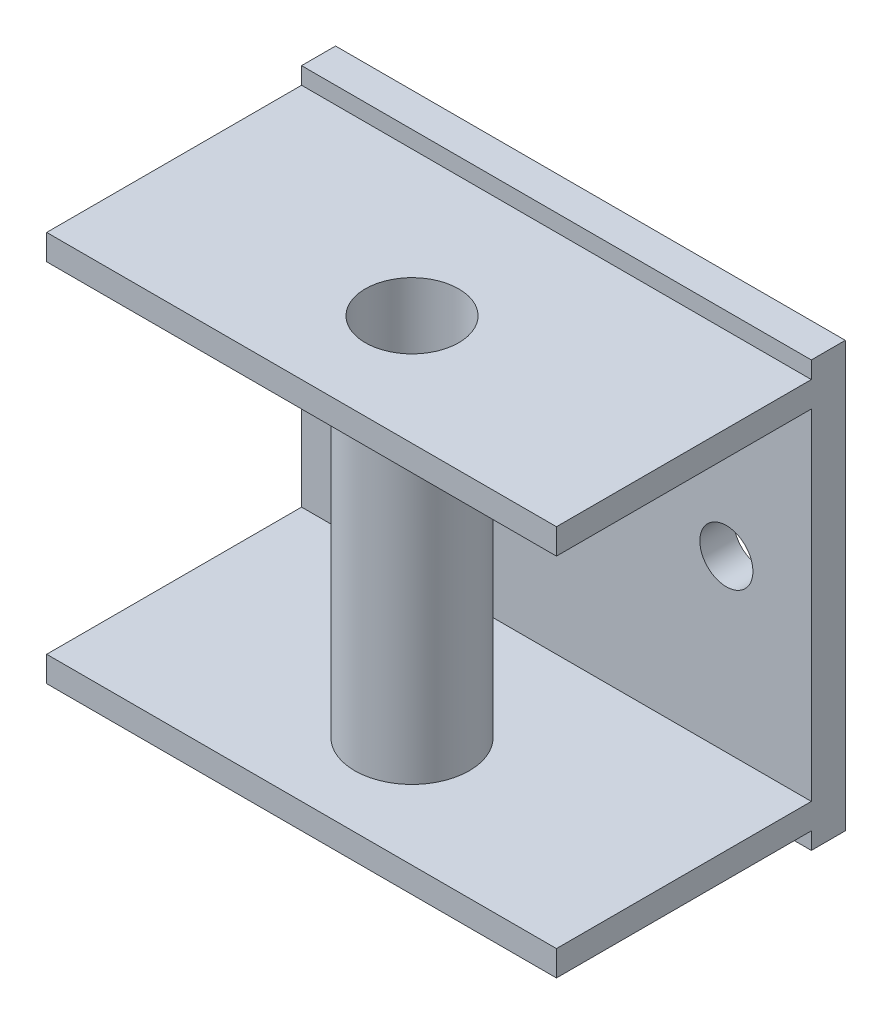
ISO-10303-21;
HEADER;
FILE_DESCRIPTION(('STEP AP214'),'2;1');
FILE_NAME('part.step','',(''),(''),'','','');
FILE_SCHEMA(('AUTOMOTIVE_DESIGN { 1 0 10303 214 1 1 1 1 }'));
ENDSEC;
DATA;
#1=APPLICATION_CONTEXT('core data for automotive mechanical design processes');
#2=APPLICATION_PROTOCOL_DEFINITION('international standard','automotive_design',2000,#1);
#3=PRODUCT_CONTEXT('',#1,'mechanical');
#4=PRODUCT('Part','Part','',(#3));
#5=PRODUCT_RELATED_PRODUCT_CATEGORY('part','',(#4));
#6=PRODUCT_DEFINITION_FORMATION('','',#4);
#7=PRODUCT_DEFINITION_CONTEXT('part definition',#1,'design');
#8=PRODUCT_DEFINITION('design','',#6,#7);
#9=PRODUCT_DEFINITION_SHAPE('','',#8);
#10=(LENGTH_UNIT() NAMED_UNIT(*) SI_UNIT(.MILLI.,.METRE.));
#11=(NAMED_UNIT(*) PLANE_ANGLE_UNIT() SI_UNIT($,.RADIAN.));
#12=(NAMED_UNIT(*) SI_UNIT($,.STERADIAN.) SOLID_ANGLE_UNIT());
#13=UNCERTAINTY_MEASURE_WITH_UNIT(LENGTH_MEASURE(1.E-05),#10,'distance_accuracy_value','');
#14=(GEOMETRIC_REPRESENTATION_CONTEXT(3) GLOBAL_UNCERTAINTY_ASSIGNED_CONTEXT((#13)) GLOBAL_UNIT_ASSIGNED_CONTEXT((#10,
#11,#12)) REPRESENTATION_CONTEXT('',''));
#15=CARTESIAN_POINT('',(0.,0.,0.));
#16=DIRECTION('',(0.,0.,1.));
#17=DIRECTION('',(1.,0.,0.));
#18=AXIS2_PLACEMENT_3D('',#15,#16,#17);
#19=CARTESIAN_POINT('',(0.,0.,8.00000000000001));
#20=DIRECTION('',(0.,0.,-1.));
#21=DIRECTION('',(-1.,0.,0.));
#22=AXIS2_PLACEMENT_3D('',#19,#20,#21);
#23=PLANE('',#22);
#24=DIRECTION('',(-1.,0.,0.));
#25=VECTOR('',#24,1.);
#26=CARTESIAN_POINT('',(-60.,46.,8.00000000000001));
#27=LINE('',#26,#25);
#28=CARTESIAN_POINT('',(60.,46.0000000000001,8.00000000000001));
#29=VERTEX_POINT('',#28);
#30=CARTESIAN_POINT('',(-60.,46.,8.00000000000001));
#31=VERTEX_POINT('',#30);
#32=EDGE_CURVE('E69',#29,#31,#27,.T.);
#33=ORIENTED_EDGE('',*,*,#32,.F.);
#34=DIRECTION('',(0.,1.,0.));
#35=VECTOR('',#34,1.);
#36=CARTESIAN_POINT('',(60.,-50.,8.00000000000023));
#37=LINE('',#36,#35);
#38=CARTESIAN_POINT('',(60.,50.,8.00000000000001));
#39=VERTEX_POINT('',#38);
#40=EDGE_CURVE('E221',#29,#39,#37,.T.);
#41=ORIENTED_EDGE('',*,*,#40,.T.);
#42=DIRECTION('',(-1.,0.,0.));
#43=VECTOR('',#42,1.);
#44=CARTESIAN_POINT('',(-60.,50.,8.00000000000001));
#45=LINE('',#44,#43);
#46=CARTESIAN_POINT('',(-60.,50.,8.00000000000001));
#47=VERTEX_POINT('',#46);
#48=EDGE_CURVE('E220',#39,#47,#45,.T.);
#49=ORIENTED_EDGE('',*,*,#48,.T.);
#50=DIRECTION('',(0.,-1.,0.));
#51=VECTOR('',#50,1.);
#52=CARTESIAN_POINT('',(-60.,-50.0000000000001,8.00000000000001));
#53=LINE('',#52,#51);
#54=EDGE_CURVE('E224',#47,#31,#53,.T.);
#55=ORIENTED_EDGE('',*,*,#54,.T.);
#56=EDGE_LOOP('',(#33,#41,#49,#55));
#57=FACE_BOUND('',#56,.T.);
#58=ADVANCED_FACE('F54',(#57),#23,.F.);
#59=CARTESIAN_POINT('',(0.,0.,8.00000000000001));
#60=DIRECTION('',(0.,0.,1.));
#61=DIRECTION('',(1.,0.,0.));
#62=AXIS2_PLACEMENT_3D('',#59,#60,#61);
#63=CIRCLE('',#62,6.25);
#64=CARTESIAN_POINT('',(-6.25,0.,8.00000000000001));
#65=VERTEX_POINT('',#64);
#66=EDGE_CURVE('E212',#65,#65,#63,.T.);
#67=ORIENTED_EDGE('',*,*,#66,.F.);
#68=EDGE_LOOP('',(#67));
#69=FACE_BOUND('',#68,.T.);
#70=CARTESIAN_POINT('',(40.,0.,7.99999999999979));
#71=DIRECTION('',(0.,0.,1.));
#72=DIRECTION('',(1.,0.,0.));
#73=AXIS2_PLACEMENT_3D('',#70,#71,#72);
#74=CIRCLE('',#73,6.25);
#75=CARTESIAN_POINT('',(33.75,0.,7.99999999999979));
#76=VERTEX_POINT('',#75);
#77=EDGE_CURVE('E206',#76,#76,#74,.T.);
#78=ORIENTED_EDGE('',*,*,#77,.F.);
#79=EDGE_LOOP('',(#78));
#80=FACE_BOUND('',#79,.T.);
#81=CARTESIAN_POINT('',(-40.,0.,8.00000000000001));
#82=DIRECTION('',(0.,0.,1.));
#83=DIRECTION('',(-1.,0.,0.));
#84=AXIS2_PLACEMENT_3D('',#81,#82,#83);
#85=CIRCLE('',#84,6.25);
#86=CARTESIAN_POINT('',(-46.25,0.,8.00000000000001));
#87=VERTEX_POINT('',#86);
#88=EDGE_CURVE('E200',#87,#87,#85,.T.);
#89=ORIENTED_EDGE('',*,*,#88,.F.);
#90=EDGE_LOOP('',(#89));
#91=FACE_BOUND('',#90,.T.);
#92=DIRECTION('',(1.,0.,0.));
#93=VECTOR('',#92,1.);
#94=CARTESIAN_POINT('',(-60.,40.,7.99999999999979));
#95=LINE('',#94,#93);
#96=CARTESIAN_POINT('',(-60.,40.,7.99999999999979));
#97=VERTEX_POINT('',#96);
#98=CARTESIAN_POINT('',(60.,40.,8.00000000000001));
#99=VERTEX_POINT('',#98);
#100=EDGE_CURVE('E164',#97,#99,#95,.T.);
#101=ORIENTED_EDGE('',*,*,#100,.F.);
#102=CARTESIAN_POINT('',(-60.,-40.,8.00000000000001));
#103=VERTEX_POINT('',#102);
#104=EDGE_CURVE('E227',#97,#103,#53,.T.);
#105=ORIENTED_EDGE('',*,*,#104,.T.);
#106=DIRECTION('',(-1.,0.,0.));
#107=VECTOR('',#106,1.);
#108=CARTESIAN_POINT('',(-60.,-40.,8.00000000000001));
#109=LINE('',#108,#107);
#110=CARTESIAN_POINT('',(60.,-40.,8.00000000000001));
#111=VERTEX_POINT('',#110);
#112=EDGE_CURVE('E170',#111,#103,#109,.T.);
#113=ORIENTED_EDGE('',*,*,#112,.F.);
#114=EDGE_CURVE('E77',#111,#99,#37,.T.);
#115=ORIENTED_EDGE('',*,*,#114,.T.);
#116=EDGE_LOOP('',(#101,#105,#113,#115));
#117=FACE_BOUND('',#116,.T.);
#118=ADVANCED_FACE('F298',(#69,#80,#91,#117),#23,.F.);
#119=DIRECTION('',(1.,0.,0.));
#120=VECTOR('',#119,1.);
#121=CARTESIAN_POINT('',(-60.,-46.,8.00000000000001));
#122=LINE('',#121,#120);
#123=CARTESIAN_POINT('',(-60.,-46.,8.00000000000001));
#124=VERTEX_POINT('',#123);
#125=CARTESIAN_POINT('',(60.,-46.,8.00000000000012));
#126=VERTEX_POINT('',#125);
#127=EDGE_CURVE('E167',#124,#126,#122,.T.);
#128=ORIENTED_EDGE('',*,*,#127,.F.);
#129=CARTESIAN_POINT('',(-60.,-50.0000000000001,8.00000000000001));
#130=VERTEX_POINT('',#129);
#131=EDGE_CURVE('E223',#124,#130,#53,.T.);
#132=ORIENTED_EDGE('',*,*,#131,.T.);
#133=DIRECTION('',(1.,0.,0.));
#134=VECTOR('',#133,1.);
#135=CARTESIAN_POINT('',(-60.,-50.0000000000001,8.00000000000001));
#136=LINE('',#135,#134);
#137=CARTESIAN_POINT('',(60.,-50.,8.00000000000023));
#138=VERTEX_POINT('',#137);
#139=EDGE_CURVE('E226',#130,#138,#136,.T.);
#140=ORIENTED_EDGE('',*,*,#139,.T.);
#141=EDGE_CURVE('E218',#138,#126,#37,.T.);
#142=ORIENTED_EDGE('',*,*,#141,.T.);
#143=EDGE_LOOP('',(#128,#132,#140,#142));
#144=FACE_BOUND('',#143,.T.);
#145=ADVANCED_FACE('F310',(#144),#23,.F.);
#146=CARTESIAN_POINT('',(0.,0.,0.));
#147=DIRECTION('',(0.,0.,-1.));
#148=DIRECTION('',(-1.,0.,0.));
#149=AXIS2_PLACEMENT_3D('',#146,#147,#148);
#150=PLANE('',#149);
#151=CARTESIAN_POINT('',(40.,0.,0.));
#152=DIRECTION('',(0.,0.,1.));
#153=DIRECTION('',(1.,0.,0.));
#154=AXIS2_PLACEMENT_3D('',#151,#152,#153);
#155=CIRCLE('',#154,6.25);
#156=CARTESIAN_POINT('',(33.75,0.,0.));
#157=VERTEX_POINT('',#156);
#158=EDGE_CURVE('E203',#157,#157,#155,.T.);
#159=ORIENTED_EDGE('',*,*,#158,.T.);
#160=EDGE_LOOP('',(#159));
#161=FACE_BOUND('',#160,.T.);
#162=DIRECTION('',(0.,1.,0.));
#163=VECTOR('',#162,1.);
#164=CARTESIAN_POINT('',(60.,-50.,0.));
#165=LINE('',#164,#163);
#166=CARTESIAN_POINT('',(60.,-50.,0.));
#167=VERTEX_POINT('',#166);
#168=CARTESIAN_POINT('',(60.,50.0000000000001,0.));
#169=VERTEX_POINT('',#168);
#170=EDGE_CURVE('E215',#167,#169,#165,.T.);
#171=ORIENTED_EDGE('',*,*,#170,.F.);
#172=DIRECTION('',(1.,0.,0.));
#173=VECTOR('',#172,1.);
#174=CARTESIAN_POINT('',(-60.,-50.0000000000001,0.));
#175=LINE('',#174,#173);
#176=CARTESIAN_POINT('',(-60.,-50.0000000000001,0.));
#177=VERTEX_POINT('',#176);
#178=EDGE_CURVE('E236',#177,#167,#175,.T.);
#179=ORIENTED_EDGE('',*,*,#178,.F.);
#180=DIRECTION('',(0.,-1.,0.));
#181=VECTOR('',#180,1.);
#182=CARTESIAN_POINT('',(-60.,-50.0000000000001,0.));
#183=LINE('',#182,#181);
#184=CARTESIAN_POINT('',(-60.,50.,0.));
#185=VERTEX_POINT('',#184);
#186=EDGE_CURVE('E234',#185,#177,#183,.T.);
#187=ORIENTED_EDGE('',*,*,#186,.F.);
#188=DIRECTION('',(-1.,0.,0.));
#189=VECTOR('',#188,1.);
#190=CARTESIAN_POINT('',(-60.,50.,0.));
#191=LINE('',#190,#189);
#192=EDGE_CURVE('E232',#169,#185,#191,.T.);
#193=ORIENTED_EDGE('',*,*,#192,.F.);
#194=EDGE_LOOP('',(#171,#179,#187,#193));
#195=FACE_BOUND('',#194,.T.);
#196=CARTESIAN_POINT('',(0.,0.,0.));
#197=DIRECTION('',(0.,0.,1.));
#198=DIRECTION('',(1.,0.,0.));
#199=AXIS2_PLACEMENT_3D('',#196,#197,#198);
#200=CIRCLE('',#199,6.25);
#201=CARTESIAN_POINT('',(-6.25,0.,0.));
#202=VERTEX_POINT('',#201);
#203=EDGE_CURVE('E209',#202,#202,#200,.T.);
#204=ORIENTED_EDGE('',*,*,#203,.T.);
#205=EDGE_LOOP('',(#204));
#206=FACE_BOUND('',#205,.T.);
#207=CARTESIAN_POINT('',(-40.,0.,0.));
#208=DIRECTION('',(0.,0.,1.));
#209=DIRECTION('',(-1.,0.,0.));
#210=AXIS2_PLACEMENT_3D('',#207,#208,#209);
#211=CIRCLE('',#210,6.25);
#212=CARTESIAN_POINT('',(-46.25,0.,0.));
#213=VERTEX_POINT('',#212);
#214=EDGE_CURVE('E199',#213,#213,#211,.T.);
#215=ORIENTED_EDGE('',*,*,#214,.T.);
#216=EDGE_LOOP('',(#215));
#217=FACE_BOUND('',#216,.T.);
#218=ADVANCED_FACE('F318',(#161,#195,#206,#217),#150,.T.);
#219=CARTESIAN_POINT('',(60.,-50.,8.00000000000023));
#220=DIRECTION('',(-1.,0.,0.));
#221=DIRECTION('',(0.,0.,1.));
#222=AXIS2_PLACEMENT_3D('',#219,#220,#221);
#223=PLANE('',#222);
#224=ORIENTED_EDGE('',*,*,#170,.T.);
#225=DIRECTION('',(0.,0.,-1.));
#226=VECTOR('',#225,1.);
#227=CARTESIAN_POINT('',(60.,50.,8.00000000000001));
#228=LINE('',#227,#226);
#229=EDGE_CURVE('E246',#39,#169,#228,.T.);
#230=ORIENTED_EDGE('',*,*,#229,.F.);
#231=ORIENTED_EDGE('',*,*,#40,.F.);
#232=DIRECTION('',(0.,0.,-1.));
#233=VECTOR('',#232,1.);
#234=CARTESIAN_POINT('',(60.,46.0000000000001,68.0000000000001));
#235=LINE('',#234,#233);
#236=CARTESIAN_POINT('',(60.,46.0000000000001,68.0000000000001));
#237=VERTEX_POINT('',#236);
#238=EDGE_CURVE('E263',#237,#29,#235,.T.);
#239=ORIENTED_EDGE('',*,*,#238,.F.);
#240=DIRECTION('',(0.,1.,0.));
#241=VECTOR('',#240,1.);
#242=CARTESIAN_POINT('',(60.,46.0000000000001,68.0000000000001));
#243=LINE('',#242,#241);
#244=CARTESIAN_POINT('',(60.,40.0000000000001,68.0000000000001));
#245=VERTEX_POINT('',#244);
#246=EDGE_CURVE('E160',#245,#237,#243,.T.);
#247=ORIENTED_EDGE('',*,*,#246,.F.);
#248=DIRECTION('',(0.,0.,-1.));
#249=VECTOR('',#248,1.);
#250=CARTESIAN_POINT('',(60.,40.0000000000001,68.0000000000001));
#251=LINE('',#250,#249);
#252=EDGE_CURVE('E172',#245,#99,#251,.T.);
#253=ORIENTED_EDGE('',*,*,#252,.T.);
#254=ORIENTED_EDGE('',*,*,#114,.F.);
#255=DIRECTION('',(0.,0.,-1.));
#256=VECTOR('',#255,1.);
#257=CARTESIAN_POINT('',(60.,-40.,68.0000000000001));
#258=LINE('',#257,#256);
#259=CARTESIAN_POINT('',(60.,-40.,68.0000000000001));
#260=VERTEX_POINT('',#259);
#261=EDGE_CURVE('E190',#260,#111,#258,.T.);
#262=ORIENTED_EDGE('',*,*,#261,.F.);
#263=DIRECTION('',(0.,1.,0.));
#264=VECTOR('',#263,1.);
#265=CARTESIAN_POINT('',(60.,-46.0000000000001,68.0000000000002));
#266=LINE('',#265,#264);
#267=CARTESIAN_POINT('',(60.,-46.0000000000001,68.0000000000002));
#268=VERTEX_POINT('',#267);
#269=EDGE_CURVE('E181',#268,#260,#266,.T.);
#270=ORIENTED_EDGE('',*,*,#269,.F.);
#271=DIRECTION('',(0.,0.,-1.));
#272=VECTOR('',#271,1.);
#273=CARTESIAN_POINT('',(60.,-46.0000000000001,68.0000000000002));
#274=LINE('',#273,#272);
#275=EDGE_CURVE('E193',#268,#126,#274,.T.);
#276=ORIENTED_EDGE('',*,*,#275,.T.);
#277=ORIENTED_EDGE('',*,*,#141,.F.);
#278=DIRECTION('',(0.,0.,-1.));
#279=VECTOR('',#278,1.);
#280=CARTESIAN_POINT('',(60.,-50.,8.00000000000023));
#281=LINE('',#280,#279);
#282=EDGE_CURVE('E229',#138,#167,#281,.T.);
#283=ORIENTED_EDGE('',*,*,#282,.T.);
#284=EDGE_LOOP('',(#224,#230,#231,#239,#247,#253,#254,#262,#270,#276,#277,#283));
#285=FACE_BOUND('',#284,.T.);
#286=ADVANCED_FACE('F56',(#285),#223,.F.);
#287=CARTESIAN_POINT('',(-60.,50.,8.00000000000001));
#288=DIRECTION('',(0.,-1.,0.));
#289=DIRECTION('',(0.,0.,-1.));
#290=AXIS2_PLACEMENT_3D('',#287,#288,#289);
#291=PLANE('',#290);
#292=ORIENTED_EDGE('',*,*,#192,.T.);
#293=DIRECTION('',(0.,0.,-1.));
#294=VECTOR('',#293,1.);
#295=CARTESIAN_POINT('',(-60.,50.,8.00000000000001));
#296=LINE('',#295,#294);
#297=EDGE_CURVE('E243',#47,#185,#296,.T.);
#298=ORIENTED_EDGE('',*,*,#297,.F.);
#299=ORIENTED_EDGE('',*,*,#48,.F.);
#300=ORIENTED_EDGE('',*,*,#229,.T.);
#301=EDGE_LOOP('',(#292,#298,#299,#300));
#302=FACE_BOUND('',#301,.T.);
#303=ADVANCED_FACE('F326',(#302),#291,.F.);
#304=CARTESIAN_POINT('',(-60.,-50.0000000000001,8.00000000000001));
#305=DIRECTION('',(1.,0.,0.));
#306=DIRECTION('',(0.,0.,-1.));
#307=AXIS2_PLACEMENT_3D('',#304,#305,#306);
#308=PLANE('',#307);
#309=ORIENTED_EDGE('',*,*,#186,.T.);
#310=DIRECTION('',(0.,0.,-1.));
#311=VECTOR('',#310,1.);
#312=CARTESIAN_POINT('',(-60.,-50.0000000000001,8.00000000000001));
#313=LINE('',#312,#311);
#314=EDGE_CURVE('E240',#130,#177,#313,.T.);
#315=ORIENTED_EDGE('',*,*,#314,.F.);
#316=ORIENTED_EDGE('',*,*,#131,.F.);
#317=DIRECTION('',(0.,0.,-1.));
#318=VECTOR('',#317,1.);
#319=CARTESIAN_POINT('',(-60.,-46.0000000000001,68.0000000000001));
#320=LINE('',#319,#318);
#321=CARTESIAN_POINT('',(-60.,-46.0000000000001,68.0000000000001));
#322=VERTEX_POINT('',#321);
#323=EDGE_CURVE('E196',#322,#124,#320,.T.);
#324=ORIENTED_EDGE('',*,*,#323,.F.);
#325=DIRECTION('',(0.,-1.,0.));
#326=VECTOR('',#325,1.);
#327=CARTESIAN_POINT('',(-60.,-46.0000000000001,68.0000000000001));
#328=LINE('',#327,#326);
#329=CARTESIAN_POINT('',(-60.,-40.,67.9999999999999));
#330=VERTEX_POINT('',#329);
#331=EDGE_CURVE('E176',#330,#322,#328,.T.);
#332=ORIENTED_EDGE('',*,*,#331,.F.);
#333=DIRECTION('',(0.,0.,-1.));
#334=VECTOR('',#333,1.);
#335=CARTESIAN_POINT('',(-60.,-40.,67.9999999999999));
#336=LINE('',#335,#334);
#337=EDGE_CURVE('E184',#330,#103,#336,.T.);
#338=ORIENTED_EDGE('',*,*,#337,.T.);
#339=ORIENTED_EDGE('',*,*,#104,.F.);
#340=DIRECTION('',(0.,0.,-1.));
#341=VECTOR('',#340,1.);
#342=CARTESIAN_POINT('',(-60.,40.,67.9999999999999));
#343=LINE('',#342,#341);
#344=CARTESIAN_POINT('',(-60.,40.,67.9999999999999));
#345=VERTEX_POINT('',#344);
#346=EDGE_CURVE('E151',#345,#97,#343,.T.);
#347=ORIENTED_EDGE('',*,*,#346,.F.);
#348=DIRECTION('',(0.,-1.,0.));
#349=VECTOR('',#348,1.);
#350=CARTESIAN_POINT('',(-60.,46.0000000000001,67.9999999999999));
#351=LINE('',#350,#349);
#352=CARTESIAN_POINT('',(-60.,46.0000000000001,67.9999999999999));
#353=VERTEX_POINT('',#352);
#354=EDGE_CURVE('E144',#353,#345,#351,.T.);
#355=ORIENTED_EDGE('',*,*,#354,.F.);
#356=DIRECTION('',(0.,0.,-1.));
#357=VECTOR('',#356,1.);
#358=CARTESIAN_POINT('',(-60.,46.0000000000001,67.9999999999999));
#359=LINE('',#358,#357);
#360=EDGE_CURVE('E149',#353,#31,#359,.T.);
#361=ORIENTED_EDGE('',*,*,#360,.T.);
#362=ORIENTED_EDGE('',*,*,#54,.F.);
#363=ORIENTED_EDGE('',*,*,#297,.T.);
#364=EDGE_LOOP('',(#309,#315,#316,#324,#332,#338,#339,#347,#355,#361,#362,#363));
#365=FACE_BOUND('',#364,.T.);
#366=ADVANCED_FACE('F146',(#365),#308,.F.);
#367=CARTESIAN_POINT('',(-60.,-50.0000000000001,8.00000000000001));
#368=DIRECTION('',(0.,1.,0.));
#369=DIRECTION('',(0.,0.,1.));
#370=AXIS2_PLACEMENT_3D('',#367,#368,#369);
#371=PLANE('',#370);
#372=ORIENTED_EDGE('',*,*,#178,.T.);
#373=ORIENTED_EDGE('',*,*,#282,.F.);
#374=ORIENTED_EDGE('',*,*,#139,.F.);
#375=ORIENTED_EDGE('',*,*,#314,.T.);
#376=EDGE_LOOP('',(#372,#373,#374,#375));
#377=FACE_BOUND('',#376,.T.);
#378=ADVANCED_FACE('F329',(#377),#371,.F.);
#379=CARTESIAN_POINT('',(0.,0.,8.00000000000001));
#380=DIRECTION('',(0.,0.,-1.));
#381=DIRECTION('',(-1.,0.,0.));
#382=AXIS2_PLACEMENT_3D('',#379,#380,#381);
#383=CYLINDRICAL_SURFACE('',#382,6.25);
#384=CARTESIAN_POINT('',(-6.25,0.,8.00000000000001));
#385=CARTESIAN_POINT('',(-6.25,0.,7.91666666666668));
#386=CARTESIAN_POINT('',(-6.25,0.,7.83333333333334));
#387=CARTESIAN_POINT('',(-6.25,0.,7.66666666666667));
#388=CARTESIAN_POINT('',(-6.25,0.,7.58333333333334));
#389=CARTESIAN_POINT('',(-6.25,0.,7.41666666666667));
#390=CARTESIAN_POINT('',(-6.25,0.,7.33333333333334));
#391=CARTESIAN_POINT('',(-6.25,0.,7.16666666666667));
#392=CARTESIAN_POINT('',(-6.25,0.,7.08333333333334));
#393=CARTESIAN_POINT('',(-6.25,0.,6.91666666666667));
#394=CARTESIAN_POINT('',(-6.25,0.,6.83333333333334));
#395=CARTESIAN_POINT('',(-6.25,0.,6.66666666666667));
#396=CARTESIAN_POINT('',(-6.25,0.,6.58333333333334));
#397=CARTESIAN_POINT('',(-6.25,0.,6.41666666666667));
#398=CARTESIAN_POINT('',(-6.25,0.,6.33333333333334));
#399=CARTESIAN_POINT('',(-6.25,0.,6.16666666666667));
#400=CARTESIAN_POINT('',(-6.25,0.,6.08333333333334));
#401=CARTESIAN_POINT('',(-6.25,0.,5.91666666666667));
#402=CARTESIAN_POINT('',(-6.25,0.,5.83333333333334));
#403=CARTESIAN_POINT('',(-6.25,0.,5.66666666666667));
#404=CARTESIAN_POINT('',(-6.25,0.,5.58333333333334));
#405=CARTESIAN_POINT('',(-6.25,0.,5.41666666666667));
#406=CARTESIAN_POINT('',(-6.25,0.,5.33333333333334));
#407=CARTESIAN_POINT('',(-6.25,0.,5.16666666666667));
#408=CARTESIAN_POINT('',(-6.25,0.,5.08333333333334));
#409=CARTESIAN_POINT('',(-6.25,0.,4.91666666666667));
#410=CARTESIAN_POINT('',(-6.25,0.,4.83333333333334));
#411=CARTESIAN_POINT('',(-6.25,0.,4.66666666666667));
#412=CARTESIAN_POINT('',(-6.25,0.,4.58333333333334));
#413=CARTESIAN_POINT('',(-6.25,0.,4.41666666666667));
#414=CARTESIAN_POINT('',(-6.25,0.,4.33333333333334));
#415=CARTESIAN_POINT('',(-6.25,0.,4.16666666666667));
#416=CARTESIAN_POINT('',(-6.25,0.,4.08333333333334));
#417=CARTESIAN_POINT('',(-6.25,0.,3.91666666666667));
#418=CARTESIAN_POINT('',(-6.25,0.,3.83333333333334));
#419=CARTESIAN_POINT('',(-6.25,0.,3.66666666666667));
#420=CARTESIAN_POINT('',(-6.25,0.,3.58333333333334));
#421=CARTESIAN_POINT('',(-6.25,0.,3.41666666666667));
#422=CARTESIAN_POINT('',(-6.25,0.,3.33333333333334));
#423=CARTESIAN_POINT('',(-6.25,0.,3.16666666666667));
#424=CARTESIAN_POINT('',(-6.25,0.,3.08333333333334));
#425=CARTESIAN_POINT('',(-6.25,0.,2.91666666666667));
#426=CARTESIAN_POINT('',(-6.25,0.,2.83333333333334));
#427=CARTESIAN_POINT('',(-6.25,0.,2.66666666666667));
#428=CARTESIAN_POINT('',(-6.25,0.,2.58333333333334));
#429=CARTESIAN_POINT('',(-6.25,0.,2.41666666666667));
#430=CARTESIAN_POINT('',(-6.25,0.,2.33333333333334));
#431=CARTESIAN_POINT('',(-6.25,0.,2.16666666666667));
#432=CARTESIAN_POINT('',(-6.25,0.,2.08333333333334));
#433=CARTESIAN_POINT('',(-6.25,0.,1.91666666666667));
#434=CARTESIAN_POINT('',(-6.25,0.,1.83333333333334));
#435=CARTESIAN_POINT('',(-6.25,0.,1.66666666666667));
#436=CARTESIAN_POINT('',(-6.25,0.,1.58333333333334));
#437=CARTESIAN_POINT('',(-6.25,0.,1.41666666666667));
#438=CARTESIAN_POINT('',(-6.25,0.,1.33333333333334));
#439=CARTESIAN_POINT('',(-6.25,0.,1.16666666666667));
#440=CARTESIAN_POINT('',(-6.25,0.,1.08333333333334));
#441=CARTESIAN_POINT('',(-6.25,0.,0.916666666666668));
#442=CARTESIAN_POINT('',(-6.25,0.,0.833333333333335));
#443=CARTESIAN_POINT('',(-6.25,0.,0.666666666666668));
#444=CARTESIAN_POINT('',(-6.25,0.,0.583333333333335));
#445=CARTESIAN_POINT('',(-6.25,0.,0.416666666666668));
#446=CARTESIAN_POINT('',(-6.25,0.,0.333333333333335));
#447=CARTESIAN_POINT('',(-6.25,0.,0.166666666666668));
#448=CARTESIAN_POINT('',(-6.25,0.,0.0833333333333348));
#449=CARTESIAN_POINT('',(-6.25,0.,0.));
#450=B_SPLINE_CURVE_WITH_KNOTS('',3,(#384,#385,#386,#387,#388,#389,#390,#391,#392,#393,#394,
#395,#396,#397,#398,#399,#400,#401,#402,#403,#404,#405,#406,#407,#408,#409,#410,#411,#412,#413,
#414,#415,#416,#417,#418,#419,#420,#421,#422,#423,#424,#425,#426,#427,#428,#429,#430,#431,#432,
#433,#434,#435,#436,#437,#438,#439,#440,#441,#442,#443,#444,#445,#446,#447,#448,#449),
.UNSPECIFIED.,.F.,.F.,(4,2,2,2,2,2,2,2,2,2,2,2,2,2,2,2,2,2,2,2,2,2,2,2,2,2,2,2,2,2,2,2,4),(0.,
0.250000000000001,0.500000000000001,0.750000000000002,1.,1.25,1.5,1.75,2.,2.25,2.5,2.75,3.,3.25,
3.5,3.75,4.,4.25,4.5,4.75000000000001,5.00000000000001,5.25000000000001,5.50000000000001,
5.75000000000001,6.00000000000001,6.25000000000001,6.50000000000001,6.75000000000001,
7.00000000000001,7.25000000000001,7.50000000000001,7.75000000000001,8.00000000000001),.UNSPECIFIED.);
#451=EDGE_CURVE('BSEAM332',#65,#202,#450,.T.);
#452=ORIENTED_EDGE('',*,*,#66,.T.);
#453=ORIENTED_EDGE('',*,*,#203,.F.);
#454=ORIENTED_EDGE('',*,*,#451,.T.);
#455=ORIENTED_EDGE('',*,*,#451,.F.);
#456=EDGE_LOOP('',(#452,#454,#453,#455));
#457=FACE_BOUND('',#456,.T.);
#458=ADVANCED_FACE('F332',(#457),#383,.F.);
#459=CARTESIAN_POINT('',(40.,0.,7.99999999999979));
#460=DIRECTION('',(0.,0.,-1.));
#461=DIRECTION('',(-1.,0.,0.));
#462=AXIS2_PLACEMENT_3D('',#459,#460,#461);
#463=CYLINDRICAL_SURFACE('',#462,6.25);
#464=CARTESIAN_POINT('',(33.75,0.,7.99999999999979));
#465=CARTESIAN_POINT('',(33.75,0.,7.91666666666646));
#466=CARTESIAN_POINT('',(33.75,0.,7.83333333333312));
#467=CARTESIAN_POINT('',(33.75,0.,7.66666666666646));
#468=CARTESIAN_POINT('',(33.75,0.,7.58333333333313));
#469=CARTESIAN_POINT('',(33.75,0.,7.41666666666647));
#470=CARTESIAN_POINT('',(33.75,0.,7.33333333333314));
#471=CARTESIAN_POINT('',(33.75,0.,7.16666666666648));
#472=CARTESIAN_POINT('',(33.75,0.,7.08333333333314));
#473=CARTESIAN_POINT('',(33.75,0.,6.91666666666648));
#474=CARTESIAN_POINT('',(33.75,0.,6.83333333333315));
#475=CARTESIAN_POINT('',(33.75,0.,6.66666666666649));
#476=CARTESIAN_POINT('',(33.75,0.,6.58333333333316));
#477=CARTESIAN_POINT('',(33.75,0.,6.4166666666665));
#478=CARTESIAN_POINT('',(33.75,0.,6.33333333333316));
#479=CARTESIAN_POINT('',(33.75,0.,6.1666666666665));
#480=CARTESIAN_POINT('',(33.75,0.,6.08333333333317));
#481=CARTESIAN_POINT('',(33.75,0.,5.91666666666651));
#482=CARTESIAN_POINT('',(33.75,0.,5.83333333333318));
#483=CARTESIAN_POINT('',(33.75,0.,5.66666666666652));
#484=CARTESIAN_POINT('',(33.75,0.,5.58333333333318));
#485=CARTESIAN_POINT('',(33.75,0.,5.41666666666652));
#486=CARTESIAN_POINT('',(33.75,0.,5.33333333333319));
#487=CARTESIAN_POINT('',(33.75,0.,5.16666666666653));
#488=CARTESIAN_POINT('',(33.75,0.,5.0833333333332));
#489=CARTESIAN_POINT('',(33.75,0.,4.91666666666654));
#490=CARTESIAN_POINT('',(33.75,0.,4.8333333333332));
#491=CARTESIAN_POINT('',(33.75,0.,4.66666666666654));
#492=CARTESIAN_POINT('',(33.75,0.,4.58333333333321));
#493=CARTESIAN_POINT('',(33.75,0.,4.41666666666655));
#494=CARTESIAN_POINT('',(33.75,0.,4.33333333333322));
#495=CARTESIAN_POINT('',(33.75,0.,4.16666666666656));
#496=CARTESIAN_POINT('',(33.75,0.,4.08333333333322));
#497=CARTESIAN_POINT('',(33.75,0.,3.91666666666656));
#498=CARTESIAN_POINT('',(33.75,0.,3.83333333333323));
#499=CARTESIAN_POINT('',(33.75,0.,3.66666666666657));
#500=CARTESIAN_POINT('',(33.75,0.,3.58333333333324));
#501=CARTESIAN_POINT('',(33.75,0.,3.41666666666658));
#502=CARTESIAN_POINT('',(33.75,0.,3.33333333333324));
#503=CARTESIAN_POINT('',(33.75,0.,3.16666666666658));
#504=CARTESIAN_POINT('',(33.75,0.,3.08333333333325));
#505=CARTESIAN_POINT('',(33.75,0.,2.91666666666659));
#506=CARTESIAN_POINT('',(33.75,0.,2.83333333333326));
#507=CARTESIAN_POINT('',(33.75,0.,2.6666666666666));
#508=CARTESIAN_POINT('',(33.75,0.,2.58333333333326));
#509=CARTESIAN_POINT('',(33.75,0.,2.4166666666666));
#510=CARTESIAN_POINT('',(33.75,0.,2.33333333333327));
#511=CARTESIAN_POINT('',(33.75,0.,2.16666666666661));
#512=CARTESIAN_POINT('',(33.75,0.,2.08333333333328));
#513=CARTESIAN_POINT('',(33.75,0.,1.91666666666662));
#514=CARTESIAN_POINT('',(33.75,0.,1.83333333333328));
#515=CARTESIAN_POINT('',(33.75,0.,1.66666666666662));
#516=CARTESIAN_POINT('',(33.75,0.,1.58333333333329));
#517=CARTESIAN_POINT('',(33.75,0.,1.41666666666663));
#518=CARTESIAN_POINT('',(33.75,0.,1.3333333333333));
#519=CARTESIAN_POINT('',(33.75,0.,1.16666666666664));
#520=CARTESIAN_POINT('',(33.75,0.,1.08333333333331));
#521=CARTESIAN_POINT('',(33.75,0.,0.916666666666643));
#522=CARTESIAN_POINT('',(33.75,0.,0.833333333333312));
#523=CARTESIAN_POINT('',(33.75,0.,0.66666666666665));
#524=CARTESIAN_POINT('',(33.75,0.,0.583333333333318));
#525=CARTESIAN_POINT('',(33.75,0.,0.416666666666656));
#526=CARTESIAN_POINT('',(33.75,0.,0.333333333333325));
#527=CARTESIAN_POINT('',(33.75,0.,0.166666666666663));
#528=CARTESIAN_POINT('',(33.75,0.,0.0833333333333327));
#529=CARTESIAN_POINT('',(33.75,0.,0.));
#530=B_SPLINE_CURVE_WITH_KNOTS('',3,(#464,#465,#466,#467,#468,#469,#470,#471,#472,#473,#474,
#475,#476,#477,#478,#479,#480,#481,#482,#483,#484,#485,#486,#487,#488,#489,#490,#491,#492,#493,
#494,#495,#496,#497,#498,#499,#500,#501,#502,#503,#504,#505,#506,#507,#508,#509,#510,#511,#512,
#513,#514,#515,#516,#517,#518,#519,#520,#521,#522,#523,#524,#525,#526,#527,#528,#529),
.UNSPECIFIED.,.F.,.F.,(4,2,2,2,2,2,2,2,2,2,2,2,2,2,2,2,2,2,2,2,2,2,2,2,2,2,2,2,2,2,2,2,4),(0.,
0.249999999999994,0.499999999999987,0.749999999999981,0.999999999999974,1.24999999999997,
1.49999999999996,1.74999999999995,1.99999999999995,2.24999999999994,2.49999999999993,
2.74999999999993,2.99999999999992,3.24999999999991,3.49999999999991,3.7499999999999,
3.99999999999989,4.24999999999989,4.49999999999988,4.74999999999987,4.99999999999987,
5.24999999999986,5.49999999999985,5.74999999999985,5.99999999999984,6.24999999999983,
6.49999999999983,6.74999999999982,6.99999999999981,7.24999999999981,7.4999999999998,
7.74999999999979,7.99999999999979),.UNSPECIFIED.);
#531=EDGE_CURVE('BSEAM352',#76,#157,#530,.T.);
#532=ORIENTED_EDGE('',*,*,#77,.T.);
#533=ORIENTED_EDGE('',*,*,#158,.F.);
#534=ORIENTED_EDGE('',*,*,#531,.T.);
#535=ORIENTED_EDGE('',*,*,#531,.F.);
#536=EDGE_LOOP('',(#532,#534,#533,#535));
#537=FACE_BOUND('',#536,.T.);
#538=ADVANCED_FACE('F352',(#537),#463,.F.);
#539=CARTESIAN_POINT('',(-40.,0.,8.00000000000001));
#540=DIRECTION('',(0.,0.,-1.));
#541=DIRECTION('',(-1.,0.,0.));
#542=AXIS2_PLACEMENT_3D('',#539,#540,#541);
#543=CYLINDRICAL_SURFACE('',#542,6.25);
#544=CARTESIAN_POINT('',(-46.25,0.,8.00000000000001));
#545=CARTESIAN_POINT('',(-46.25,0.,7.91666666666668));
#546=CARTESIAN_POINT('',(-46.25,0.,7.83333333333334));
#547=CARTESIAN_POINT('',(-46.25,0.,7.66666666666667));
#548=CARTESIAN_POINT('',(-46.25,0.,7.58333333333334));
#549=CARTESIAN_POINT('',(-46.25,0.,7.41666666666667));
#550=CARTESIAN_POINT('',(-46.25,0.,7.33333333333334));
#551=CARTESIAN_POINT('',(-46.25,0.,7.16666666666667));
#552=CARTESIAN_POINT('',(-46.25,0.,7.08333333333334));
#553=CARTESIAN_POINT('',(-46.25,0.,6.91666666666667));
#554=CARTESIAN_POINT('',(-46.25,0.,6.83333333333334));
#555=CARTESIAN_POINT('',(-46.25,0.,6.66666666666667));
#556=CARTESIAN_POINT('',(-46.25,0.,6.58333333333334));
#557=CARTESIAN_POINT('',(-46.25,0.,6.41666666666667));
#558=CARTESIAN_POINT('',(-46.25,0.,6.33333333333334));
#559=CARTESIAN_POINT('',(-46.25,0.,6.16666666666667));
#560=CARTESIAN_POINT('',(-46.25,0.,6.08333333333334));
#561=CARTESIAN_POINT('',(-46.25,0.,5.91666666666667));
#562=CARTESIAN_POINT('',(-46.25,0.,5.83333333333334));
#563=CARTESIAN_POINT('',(-46.25,0.,5.66666666666667));
#564=CARTESIAN_POINT('',(-46.25,0.,5.58333333333334));
#565=CARTESIAN_POINT('',(-46.25,0.,5.41666666666667));
#566=CARTESIAN_POINT('',(-46.25,0.,5.33333333333334));
#567=CARTESIAN_POINT('',(-46.25,0.,5.16666666666667));
#568=CARTESIAN_POINT('',(-46.25,0.,5.08333333333334));
#569=CARTESIAN_POINT('',(-46.25,0.,4.91666666666667));
#570=CARTESIAN_POINT('',(-46.25,0.,4.83333333333334));
#571=CARTESIAN_POINT('',(-46.25,0.,4.66666666666667));
#572=CARTESIAN_POINT('',(-46.25,0.,4.58333333333334));
#573=CARTESIAN_POINT('',(-46.25,0.,4.41666666666667));
#574=CARTESIAN_POINT('',(-46.25,0.,4.33333333333334));
#575=CARTESIAN_POINT('',(-46.25,0.,4.16666666666667));
#576=CARTESIAN_POINT('',(-46.25,0.,4.08333333333334));
#577=CARTESIAN_POINT('',(-46.25,0.,3.91666666666667));
#578=CARTESIAN_POINT('',(-46.25,0.,3.83333333333334));
#579=CARTESIAN_POINT('',(-46.25,0.,3.66666666666667));
#580=CARTESIAN_POINT('',(-46.25,0.,3.58333333333334));
#581=CARTESIAN_POINT('',(-46.25,0.,3.41666666666667));
#582=CARTESIAN_POINT('',(-46.25,0.,3.33333333333334));
#583=CARTESIAN_POINT('',(-46.25,0.,3.16666666666667));
#584=CARTESIAN_POINT('',(-46.25,0.,3.08333333333334));
#585=CARTESIAN_POINT('',(-46.25,0.,2.91666666666667));
#586=CARTESIAN_POINT('',(-46.25,0.,2.83333333333334));
#587=CARTESIAN_POINT('',(-46.25,0.,2.66666666666667));
#588=CARTESIAN_POINT('',(-46.25,0.,2.58333333333334));
#589=CARTESIAN_POINT('',(-46.25,0.,2.41666666666667));
#590=CARTESIAN_POINT('',(-46.25,0.,2.33333333333334));
#591=CARTESIAN_POINT('',(-46.25,0.,2.16666666666667));
#592=CARTESIAN_POINT('',(-46.25,0.,2.08333333333334));
#593=CARTESIAN_POINT('',(-46.25,0.,1.91666666666667));
#594=CARTESIAN_POINT('',(-46.25,0.,1.83333333333334));
#595=CARTESIAN_POINT('',(-46.25,0.,1.66666666666667));
#596=CARTESIAN_POINT('',(-46.25,0.,1.58333333333334));
#597=CARTESIAN_POINT('',(-46.25,0.,1.41666666666667));
#598=CARTESIAN_POINT('',(-46.25,0.,1.33333333333334));
#599=CARTESIAN_POINT('',(-46.25,0.,1.16666666666667));
#600=CARTESIAN_POINT('',(-46.25,0.,1.08333333333334));
#601=CARTESIAN_POINT('',(-46.25,0.,0.916666666666668));
#602=CARTESIAN_POINT('',(-46.25,0.,0.833333333333335));
#603=CARTESIAN_POINT('',(-46.25,0.,0.666666666666668));
#604=CARTESIAN_POINT('',(-46.25,0.,0.583333333333335));
#605=CARTESIAN_POINT('',(-46.25,0.,0.416666666666668));
#606=CARTESIAN_POINT('',(-46.25,0.,0.333333333333335));
#607=CARTESIAN_POINT('',(-46.25,0.,0.166666666666668));
#608=CARTESIAN_POINT('',(-46.25,0.,0.0833333333333348));
#609=CARTESIAN_POINT('',(-46.25,0.,0.));
#610=B_SPLINE_CURVE_WITH_KNOTS('',3,(#544,#545,#546,#547,#548,#549,#550,#551,#552,#553,#554,
#555,#556,#557,#558,#559,#560,#561,#562,#563,#564,#565,#566,#567,#568,#569,#570,#571,#572,#573,
#574,#575,#576,#577,#578,#579,#580,#581,#582,#583,#584,#585,#586,#587,#588,#589,#590,#591,#592,
#593,#594,#595,#596,#597,#598,#599,#600,#601,#602,#603,#604,#605,#606,#607,#608,#609),
.UNSPECIFIED.,.F.,.F.,(4,2,2,2,2,2,2,2,2,2,2,2,2,2,2,2,2,2,2,2,2,2,2,2,2,2,2,2,2,2,2,2,4),(0.,
0.250000000000001,0.500000000000001,0.750000000000002,1.,1.25,1.5,1.75,2.,2.25,2.5,2.75,3.,3.25,
3.5,3.75,4.,4.25,4.5,4.75000000000001,5.00000000000001,5.25000000000001,5.50000000000001,
5.75000000000001,6.00000000000001,6.25000000000001,6.50000000000001,6.75000000000001,
7.00000000000001,7.25000000000001,7.50000000000001,7.75000000000001,8.00000000000001),.UNSPECIFIED.);
#611=EDGE_CURVE('BSEAM283',#87,#213,#610,.T.);
#612=ORIENTED_EDGE('',*,*,#88,.T.);
#613=ORIENTED_EDGE('',*,*,#214,.F.);
#614=ORIENTED_EDGE('',*,*,#611,.T.);
#615=ORIENTED_EDGE('',*,*,#611,.F.);
#616=EDGE_LOOP('',(#612,#614,#613,#615));
#617=FACE_BOUND('',#616,.T.);
#618=ADVANCED_FACE('F283',(#617),#543,.F.);
#619=CARTESIAN_POINT('',(-60.,-46.0000000000001,68.0000000000001));
#620=DIRECTION('',(0.,1.,0.));
#621=DIRECTION('',(0.,0.,1.));
#622=AXIS2_PLACEMENT_3D('',#619,#620,#621);
#623=PLANE('',#622);
#624=CARTESIAN_POINT('',(0.,-46.,41.9999999999999));
#625=DIRECTION('',(0.,-1.,0.));
#626=DIRECTION('',(0.,0.,-1.));
#627=AXIS2_PLACEMENT_3D('',#624,#625,#626);
#628=CIRCLE('',#627,11.);
#629=CARTESIAN_POINT('',(0.,-46.,30.9999999999999));
#630=VERTEX_POINT('',#629);
#631=EDGE_CURVE('E272',#630,#630,#628,.T.);
#632=ORIENTED_EDGE('',*,*,#631,.F.);
#633=EDGE_LOOP('',(#632));
#634=FACE_BOUND('',#633,.T.);
#635=ORIENTED_EDGE('',*,*,#127,.T.);
#636=ORIENTED_EDGE('',*,*,#275,.F.);
#637=DIRECTION('',(1.,0.,0.));
#638=VECTOR('',#637,1.);
#639=CARTESIAN_POINT('',(-60.,-46.0000000000001,68.0000000000001));
#640=LINE('',#639,#638);
#641=EDGE_CURVE('E179',#322,#268,#640,.T.);
#642=ORIENTED_EDGE('',*,*,#641,.F.);
#643=ORIENTED_EDGE('',*,*,#323,.T.);
#644=EDGE_LOOP('',(#635,#636,#642,#643));
#645=FACE_BOUND('',#644,.T.);
#646=ADVANCED_FACE('F279',(#634,#645),#623,.F.);
#647=CARTESIAN_POINT('',(-60.,-40.,67.9999999999999));
#648=DIRECTION('',(0.,-1.,0.));
#649=DIRECTION('',(0.,0.,-1.));
#650=AXIS2_PLACEMENT_3D('',#647,#648,#649);
#651=PLANE('',#650);
#652=CARTESIAN_POINT('',(0.,-40.0000000000205,42.));
#653=DIRECTION('',(0.,-1.,0.));
#654=DIRECTION('',(0.,0.,-1.));
#655=AXIS2_PLACEMENT_3D('',#652,#653,#654);
#656=CIRCLE('',#655,13.5);
#657=CARTESIAN_POINT('',(0.,-40.0000000000205,28.5));
#658=VERTEX_POINT('',#657);
#659=EDGE_CURVE('E14',#658,#658,#656,.F.);
#660=ORIENTED_EDGE('',*,*,#659,.F.);
#661=EDGE_LOOP('',(#660));
#662=FACE_BOUND('',#661,.T.);
#663=ORIENTED_EDGE('',*,*,#112,.T.);
#664=ORIENTED_EDGE('',*,*,#337,.F.);
#665=DIRECTION('',(-1.,0.,0.));
#666=VECTOR('',#665,1.);
#667=CARTESIAN_POINT('',(-60.,-40.,67.9999999999999));
#668=LINE('',#667,#666);
#669=EDGE_CURVE('E183',#260,#330,#668,.T.);
#670=ORIENTED_EDGE('',*,*,#669,.F.);
#671=ORIENTED_EDGE('',*,*,#261,.T.);
#672=EDGE_LOOP('',(#663,#664,#670,#671));
#673=FACE_BOUND('',#672,.T.);
#674=ADVANCED_FACE('F282',(#662,#673),#651,.F.);
#675=CARTESIAN_POINT('',(0.,0.,67.9999999999998));
#676=DIRECTION('',(0.,0.,-1.));
#677=DIRECTION('',(-1.,0.,0.));
#678=AXIS2_PLACEMENT_3D('',#675,#676,#677);
#679=PLANE('',#678);
#680=ORIENTED_EDGE('',*,*,#331,.T.);
#681=ORIENTED_EDGE('',*,*,#641,.T.);
#682=ORIENTED_EDGE('',*,*,#269,.T.);
#683=ORIENTED_EDGE('',*,*,#669,.T.);
#684=EDGE_LOOP('',(#680,#681,#682,#683));
#685=FACE_BOUND('',#684,.T.);
#686=ADVANCED_FACE('F293',(#685),#679,.F.);
#687=CARTESIAN_POINT('',(-60.,46.0000000000001,67.9999999999999));
#688=DIRECTION('',(0.,-1.,0.));
#689=DIRECTION('',(0.,0.,-1.));
#690=AXIS2_PLACEMENT_3D('',#687,#688,#689);
#691=PLANE('',#690);
#692=CARTESIAN_POINT('',(0.,46.,42.));
#693=DIRECTION('',(0.,-1.,0.));
#694=DIRECTION('',(0.,0.,-1.));
#695=AXIS2_PLACEMENT_3D('',#692,#693,#694);
#696=CIRCLE('',#695,11.);
#697=CARTESIAN_POINT('',(0.,46.,31.));
#698=VERTEX_POINT('',#697);
#699=EDGE_CURVE('E267',#698,#698,#696,.T.);
#700=ORIENTED_EDGE('',*,*,#699,.T.);
#701=EDGE_LOOP('',(#700));
#702=FACE_BOUND('',#701,.T.);
#703=ORIENTED_EDGE('',*,*,#32,.T.);
#704=ORIENTED_EDGE('',*,*,#360,.F.);
#705=DIRECTION('',(-1.,0.,0.));
#706=VECTOR('',#705,1.);
#707=CARTESIAN_POINT('',(-60.,46.0000000000001,67.9999999999999));
#708=LINE('',#707,#706);
#709=EDGE_CURVE('E155',#237,#353,#708,.T.);
#710=ORIENTED_EDGE('',*,*,#709,.F.);
#711=ORIENTED_EDGE('',*,*,#238,.T.);
#712=EDGE_LOOP('',(#703,#704,#710,#711));
#713=FACE_BOUND('',#712,.T.);
#714=ADVANCED_FACE('F166',(#702,#713),#691,.F.);
#715=CARTESIAN_POINT('',(-60.,40.,67.9999999999999));
#716=DIRECTION('',(0.,1.,0.));
#717=DIRECTION('',(0.,0.,1.));
#718=AXIS2_PLACEMENT_3D('',#715,#716,#717);
#719=PLANE('',#718);
#720=CARTESIAN_POINT('',(0.,40.0000000000205,42.0000000000001));
#721=DIRECTION('',(0.,1.,0.));
#722=DIRECTION('',(0.,0.,1.));
#723=AXIS2_PLACEMENT_3D('',#720,#721,#722);
#724=CIRCLE('',#723,13.5);
#725=CARTESIAN_POINT('',(0.,40.0000000000205,55.5000000000001));
#726=VERTEX_POINT('',#725);
#727=EDGE_CURVE('E62',#726,#726,#724,.F.);
#728=ORIENTED_EDGE('',*,*,#727,.F.);
#729=EDGE_LOOP('',(#728));
#730=FACE_BOUND('',#729,.T.);
#731=ORIENTED_EDGE('',*,*,#100,.T.);
#732=ORIENTED_EDGE('',*,*,#252,.F.);
#733=DIRECTION('',(1.,0.,0.));
#734=VECTOR('',#733,1.);
#735=CARTESIAN_POINT('',(-60.,40.,67.9999999999999));
#736=LINE('',#735,#734);
#737=EDGE_CURVE('E154',#345,#245,#736,.T.);
#738=ORIENTED_EDGE('',*,*,#737,.F.);
#739=ORIENTED_EDGE('',*,*,#346,.T.);
#740=EDGE_LOOP('',(#731,#732,#738,#739));
#741=FACE_BOUND('',#740,.T.);
#742=ADVANCED_FACE('F254',(#730,#741),#719,.F.);
#743=CARTESIAN_POINT('',(0.,0.,67.9999999999998));
#744=DIRECTION('',(0.,0.,-1.));
#745=DIRECTION('',(-1.,0.,0.));
#746=AXIS2_PLACEMENT_3D('',#743,#744,#745);
#747=PLANE('',#746);
#748=ORIENTED_EDGE('',*,*,#709,.T.);
#749=ORIENTED_EDGE('',*,*,#354,.T.);
#750=ORIENTED_EDGE('',*,*,#737,.T.);
#751=ORIENTED_EDGE('',*,*,#246,.T.);
#752=EDGE_LOOP('',(#748,#749,#750,#751));
#753=FACE_BOUND('',#752,.T.);
#754=ADVANCED_FACE('F158',(#753),#747,.F.);
#755=CARTESIAN_POINT('',(0.,50.,42.));
#756=DIRECTION('',(0.,-1.,0.));
#757=DIRECTION('',(0.,0.,-1.));
#758=AXIS2_PLACEMENT_3D('',#755,#756,#757);
#759=CYLINDRICAL_SURFACE('',#758,11.);
#760=ORIENTED_EDGE('',*,*,#631,.T.);
#761=EDGE_LOOP('',(#760));
#762=FACE_BOUND('',#761,.T.);
#763=ORIENTED_EDGE('',*,*,#699,.F.);
#764=EDGE_LOOP('',(#763));
#765=FACE_BOUND('',#764,.T.);
#766=ADVANCED_FACE('F276',(#762,#765),#759,.F.);
#767=CARTESIAN_POINT('',(0.,-500000.000000001,41.9999999999714));
#768=DIRECTION('',(0.,1.,0.));
#769=DIRECTION('',(0.,0.,1.));
#770=AXIS2_PLACEMENT_3D('',#767,#768,#769);
#771=CYLINDRICAL_SURFACE('',#770,13.5);
#772=ORIENTED_EDGE('',*,*,#727,.T.);
#773=EDGE_LOOP('',(#772));
#774=FACE_BOUND('',#773,.T.);
#775=ORIENTED_EDGE('',*,*,#659,.T.);
#776=EDGE_LOOP('',(#775));
#777=FACE_BOUND('',#776,.T.);
#778=ADVANCED_FACE('F251',(#774,#777),#771,.T.);
#779=CLOSED_SHELL('',(#58,#118,#145,#218,#286,#303,#366,#378,#458,#538,#618,#646,#674,#686,#714,
#742,#754,#766,#778));
#780=MANIFOLD_SOLID_BREP('B2',#779);
#781=ADVANCED_BREP_SHAPE_REPRESENTATION('',(#18,#780),#14);
#782=SHAPE_DEFINITION_REPRESENTATION(#9,#781);
ENDSEC;
END-ISO-10303-21;
